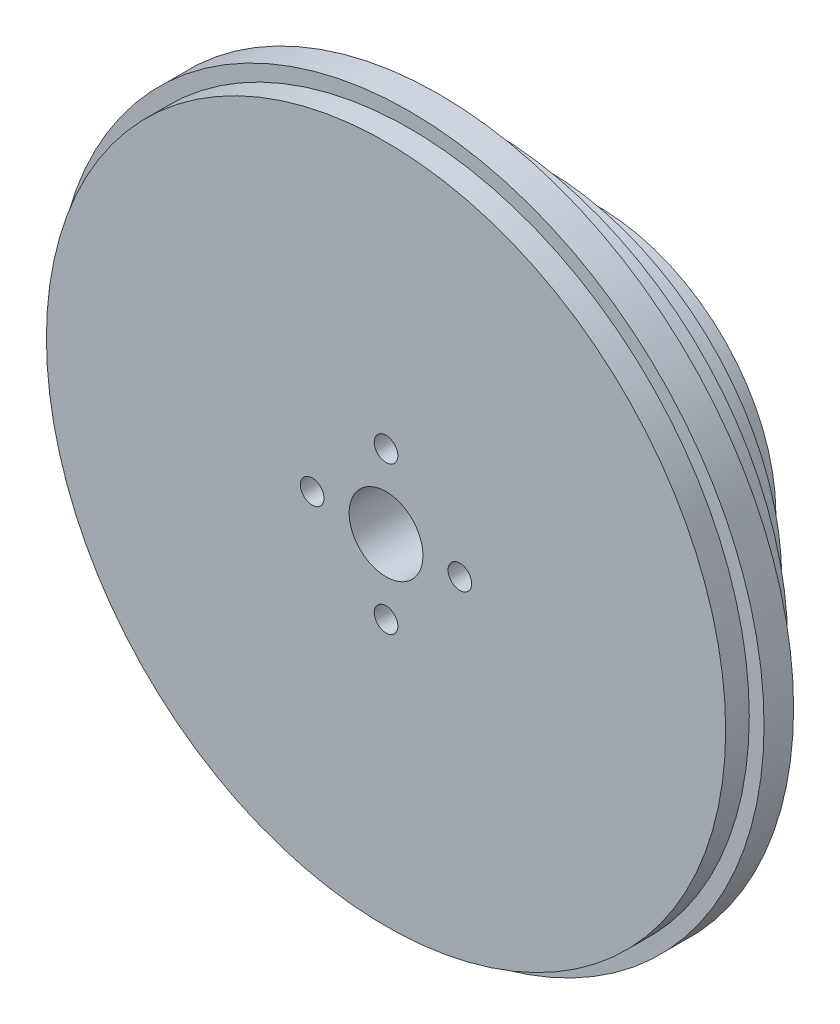
ISO-10303-21;
HEADER;
FILE_DESCRIPTION(('STEP AP214'),'2;1');
FILE_NAME('part.step','',(''),(''),'','','');
FILE_SCHEMA(('AUTOMOTIVE_DESIGN { 1 0 10303 214 1 1 1 1 }'));
ENDSEC;
DATA;
#1=APPLICATION_CONTEXT('core data for automotive mechanical design processes');
#2=APPLICATION_PROTOCOL_DEFINITION('international standard','automotive_design',2000,#1);
#3=PRODUCT_CONTEXT('',#1,'mechanical');
#4=PRODUCT('Part','Part','',(#3));
#5=PRODUCT_RELATED_PRODUCT_CATEGORY('part','',(#4));
#6=PRODUCT_DEFINITION_FORMATION('','',#4);
#7=PRODUCT_DEFINITION_CONTEXT('part definition',#1,'design');
#8=PRODUCT_DEFINITION('design','',#6,#7);
#9=PRODUCT_DEFINITION_SHAPE('','',#8);
#10=(LENGTH_UNIT() NAMED_UNIT(*) SI_UNIT(.MILLI.,.METRE.));
#11=(NAMED_UNIT(*) PLANE_ANGLE_UNIT() SI_UNIT($,.RADIAN.));
#12=(NAMED_UNIT(*) SI_UNIT($,.STERADIAN.) SOLID_ANGLE_UNIT());
#13=UNCERTAINTY_MEASURE_WITH_UNIT(LENGTH_MEASURE(1.E-05),#10,'distance_accuracy_value','');
#14=(GEOMETRIC_REPRESENTATION_CONTEXT(3) GLOBAL_UNCERTAINTY_ASSIGNED_CONTEXT((#13)) GLOBAL_UNIT_ASSIGNED_CONTEXT((#10,
#11,#12)) REPRESENTATION_CONTEXT('',''));
#15=CARTESIAN_POINT('',(0.,0.,0.));
#16=DIRECTION('',(0.,0.,1.));
#17=DIRECTION('',(1.,0.,0.));
#18=AXIS2_PLACEMENT_3D('',#15,#16,#17);
#19=CARTESIAN_POINT('',(0.,0.,51.));
#20=DIRECTION('',(0.,0.,1.));
#21=DIRECTION('',(1.,0.,0.));
#22=AXIS2_PLACEMENT_3D('',#19,#20,#21);
#23=PLANE('',#22);
#24=CARTESIAN_POINT('',(0.,0.,51.));
#25=DIRECTION('',(0.,0.,1.));
#26=DIRECTION('',(1.,0.,0.));
#27=AXIS2_PLACEMENT_3D('',#24,#25,#26);
#28=CIRCLE('',#27,100.);
#29=CARTESIAN_POINT('',(100.,0.,51.));
#30=VERTEX_POINT('',#29);
#31=EDGE_CURVE('E24',#30,#30,#28,.T.);
#32=ORIENTED_EDGE('',*,*,#31,.F.);
#33=EDGE_LOOP('',(#32));
#34=FACE_BOUND('',#33,.T.);
#35=CARTESIAN_POINT('',(0.,0.,51.));
#36=DIRECTION('',(0.,0.,1.));
#37=DIRECTION('',(1.,0.,0.));
#38=AXIS2_PLACEMENT_3D('',#35,#36,#37);
#39=CIRCLE('',#38,75.);
#40=CARTESIAN_POINT('',(75.,0.,51.));
#41=VERTEX_POINT('',#40);
#42=EDGE_CURVE('E41',#41,#41,#39,.T.);
#43=ORIENTED_EDGE('',*,*,#42,.T.);
#44=EDGE_LOOP('',(#43));
#45=FACE_BOUND('',#44,.T.);
#46=ADVANCED_FACE('F16',(#34,#45),#23,.F.);
#47=CARTESIAN_POINT('',(0.,0.,51.));
#48=DIRECTION('',(0.,0.,1.));
#49=DIRECTION('',(1.,0.,0.));
#50=AXIS2_PLACEMENT_3D('',#47,#48,#49);
#51=CYLINDRICAL_SURFACE('',#50,100.);
#52=ORIENTED_EDGE('',*,*,#31,.T.);
#53=DIRECTION('',(0.,0.,1.));
#54=VECTOR('',#53,1.);
#55=CARTESIAN_POINT('',(100.,0.,51.));
#56=LINE('',#55,#54);
#57=CARTESIAN_POINT('',(100.,0.,61.));
#58=VERTEX_POINT('',#57);
#59=EDGE_CURVE('E10',#30,#58,#56,.T.);
#60=ORIENTED_EDGE('',*,*,#59,.T.);
#61=CARTESIAN_POINT('',(0.,0.,61.));
#62=DIRECTION('',(0.,0.,1.));
#63=DIRECTION('',(1.,0.,0.));
#64=AXIS2_PLACEMENT_3D('',#61,#62,#63);
#65=CIRCLE('',#64,100.);
#66=EDGE_CURVE('E219',#58,#58,#65,.T.);
#67=ORIENTED_EDGE('',*,*,#66,.F.);
#68=ORIENTED_EDGE('',*,*,#59,.F.);
#69=EDGE_LOOP('',(#52,#60,#67,#68));
#70=FACE_BOUND('',#69,.T.);
#71=ADVANCED_FACE('F332',(#70),#51,.T.);
#72=CARTESIAN_POINT('',(0.,0.,43.));
#73=DIRECTION('',(0.,0.,1.));
#74=DIRECTION('',(1.,0.,0.));
#75=AXIS2_PLACEMENT_3D('',#72,#73,#74);
#76=CYLINDRICAL_SURFACE('',#75,75.);
#77=CARTESIAN_POINT('',(0.,0.,43.));
#78=DIRECTION('',(0.,0.,1.));
#79=DIRECTION('',(1.,0.,0.));
#80=AXIS2_PLACEMENT_3D('',#77,#78,#79);
#81=CIRCLE('',#80,75.);
#82=CARTESIAN_POINT('',(75.,0.,43.));
#83=VERTEX_POINT('',#82);
#84=EDGE_CURVE('E224',#83,#83,#81,.T.);
#85=ORIENTED_EDGE('',*,*,#84,.T.);
#86=DIRECTION('',(0.,0.,1.));
#87=VECTOR('',#86,1.);
#88=CARTESIAN_POINT('',(75.,0.,43.));
#89=LINE('',#88,#87);
#90=EDGE_CURVE('E223',#83,#41,#89,.T.);
#91=ORIENTED_EDGE('',*,*,#90,.T.);
#92=ORIENTED_EDGE('',*,*,#42,.F.);
#93=ORIENTED_EDGE('',*,*,#90,.F.);
#94=EDGE_LOOP('',(#85,#91,#92,#93));
#95=FACE_BOUND('',#94,.T.);
#96=ADVANCED_FACE('F337',(#95),#76,.T.);
#97=CARTESIAN_POINT('',(0.,0.,61.));
#98=DIRECTION('',(0.,0.,1.));
#99=DIRECTION('',(1.,0.,0.));
#100=AXIS2_PLACEMENT_3D('',#97,#98,#99);
#101=PLANE('',#100);
#102=CARTESIAN_POINT('',(0.,0.,61.));
#103=DIRECTION('',(0.,0.,1.));
#104=DIRECTION('',(1.,0.,0.));
#105=AXIS2_PLACEMENT_3D('',#102,#103,#104);
#106=CIRCLE('',#105,95.);
#107=CARTESIAN_POINT('',(95.,0.,61.));
#108=VERTEX_POINT('',#107);
#109=EDGE_CURVE('E257',#108,#108,#106,.T.);
#110=ORIENTED_EDGE('',*,*,#109,.F.);
#111=EDGE_LOOP('',(#110));
#112=FACE_BOUND('',#111,.T.);
#113=ORIENTED_EDGE('',*,*,#66,.T.);
#114=EDGE_LOOP('',(#113));
#115=FACE_BOUND('',#114,.T.);
#116=ADVANCED_FACE('F341',(#112,#115),#101,.T.);
#117=CARTESIAN_POINT('',(0.,0.,43.));
#118=DIRECTION('',(0.,0.,1.));
#119=DIRECTION('',(1.,0.,0.));
#120=AXIS2_PLACEMENT_3D('',#117,#118,#119);
#121=PLANE('',#120);
#122=ORIENTED_EDGE('',*,*,#84,.F.);
#123=EDGE_LOOP('',(#122));
#124=FACE_BOUND('',#123,.T.);
#125=CARTESIAN_POINT('',(0.,0.,43.));
#126=DIRECTION('',(0.,0.,1.));
#127=DIRECTION('',(1.,0.,0.));
#128=AXIS2_PLACEMENT_3D('',#125,#126,#127);
#129=CIRCLE('',#128,80.);
#130=CARTESIAN_POINT('',(80.,0.,43.));
#131=VERTEX_POINT('',#130);
#132=EDGE_CURVE('E254',#131,#131,#129,.T.);
#133=ORIENTED_EDGE('',*,*,#132,.T.);
#134=EDGE_LOOP('',(#133));
#135=FACE_BOUND('',#134,.T.);
#136=ADVANCED_FACE('F347',(#124,#135),#121,.T.);
#137=CARTESIAN_POINT('',(0.,0.,61.));
#138=DIRECTION('',(0.,0.,1.));
#139=DIRECTION('',(1.,0.,0.));
#140=AXIS2_PLACEMENT_3D('',#137,#138,#139);
#141=CYLINDRICAL_SURFACE('',#140,95.);
#142=ORIENTED_EDGE('',*,*,#109,.T.);
#143=DIRECTION('',(0.,0.,1.));
#144=VECTOR('',#143,1.);
#145=CARTESIAN_POINT('',(95.,0.,61.));
#146=LINE('',#145,#144);
#147=CARTESIAN_POINT('',(95.,0.,69.));
#148=VERTEX_POINT('',#147);
#149=EDGE_CURVE('E261',#108,#148,#146,.T.);
#150=ORIENTED_EDGE('',*,*,#149,.T.);
#151=CARTESIAN_POINT('',(0.,0.,69.));
#152=DIRECTION('',(0.,0.,1.));
#153=DIRECTION('',(1.,0.,0.));
#154=AXIS2_PLACEMENT_3D('',#151,#152,#153);
#155=CIRCLE('',#154,95.);
#156=EDGE_CURVE('E246',#148,#148,#155,.T.);
#157=ORIENTED_EDGE('',*,*,#156,.F.);
#158=ORIENTED_EDGE('',*,*,#149,.F.);
#159=EDGE_LOOP('',(#142,#150,#157,#158));
#160=FACE_BOUND('',#159,.T.);
#161=ADVANCED_FACE('F351',(#160),#141,.T.);
#162=CARTESIAN_POINT('',(0.,0.,33.));
#163=DIRECTION('',(0.,0.,1.));
#164=DIRECTION('',(1.,0.,0.));
#165=AXIS2_PLACEMENT_3D('',#162,#163,#164);
#166=CYLINDRICAL_SURFACE('',#165,80.);
#167=CARTESIAN_POINT('',(0.,0.,33.));
#168=DIRECTION('',(0.,0.,1.));
#169=DIRECTION('',(1.,0.,0.));
#170=AXIS2_PLACEMENT_3D('',#167,#168,#169);
#171=CIRCLE('',#170,80.);
#172=CARTESIAN_POINT('',(80.,0.,33.));
#173=VERTEX_POINT('',#172);
#174=EDGE_CURVE('E242',#173,#173,#171,.T.);
#175=ORIENTED_EDGE('',*,*,#174,.T.);
#176=DIRECTION('',(0.,0.,1.));
#177=VECTOR('',#176,1.);
#178=CARTESIAN_POINT('',(80.,0.,33.));
#179=LINE('',#178,#177);
#180=EDGE_CURVE('E250',#173,#131,#179,.T.);
#181=ORIENTED_EDGE('',*,*,#180,.T.);
#182=ORIENTED_EDGE('',*,*,#132,.F.);
#183=ORIENTED_EDGE('',*,*,#180,.F.);
#184=EDGE_LOOP('',(#175,#181,#182,#183));
#185=FACE_BOUND('',#184,.T.);
#186=ADVANCED_FACE('F355',(#185),#166,.T.);
#187=CARTESIAN_POINT('',(0.,0.,69.));
#188=DIRECTION('',(0.,0.,1.));
#189=DIRECTION('',(1.,0.,0.));
#190=AXIS2_PLACEMENT_3D('',#187,#188,#189);
#191=PLANE('',#190);
#192=CARTESIAN_POINT('',(0.,0.,69.));
#193=DIRECTION('',(0.,0.,1.));
#194=DIRECTION('',(1.,0.,0.));
#195=AXIS2_PLACEMENT_3D('',#192,#193,#194);
#196=CIRCLE('',#195,120.);
#197=CARTESIAN_POINT('',(120.,0.,69.));
#198=VERTEX_POINT('',#197);
#199=EDGE_CURVE('E235',#198,#198,#196,.T.);
#200=ORIENTED_EDGE('',*,*,#199,.F.);
#201=EDGE_LOOP('',(#200));
#202=FACE_BOUND('',#201,.T.);
#203=ORIENTED_EDGE('',*,*,#156,.T.);
#204=EDGE_LOOP('',(#203));
#205=FACE_BOUND('',#204,.T.);
#206=ADVANCED_FACE('F357',(#202,#205),#191,.F.);
#207=CARTESIAN_POINT('',(0.,0.,33.));
#208=DIRECTION('',(0.,0.,1.));
#209=DIRECTION('',(1.,0.,0.));
#210=AXIS2_PLACEMENT_3D('',#207,#208,#209);
#211=PLANE('',#210);
#212=ORIENTED_EDGE('',*,*,#174,.F.);
#213=EDGE_LOOP('',(#212));
#214=FACE_BOUND('',#213,.T.);
#215=CARTESIAN_POINT('',(0.,0.,33.));
#216=DIRECTION('',(0.,0.,1.));
#217=DIRECTION('',(1.,0.,0.));
#218=AXIS2_PLACEMENT_3D('',#215,#216,#217);
#219=CIRCLE('',#218,55.);
#220=CARTESIAN_POINT('',(55.,0.,33.));
#221=VERTEX_POINT('',#220);
#222=EDGE_CURVE('E232',#221,#221,#219,.T.);
#223=ORIENTED_EDGE('',*,*,#222,.T.);
#224=EDGE_LOOP('',(#223));
#225=FACE_BOUND('',#224,.T.);
#226=ADVANCED_FACE('F360',(#214,#225),#211,.F.);
#227=CARTESIAN_POINT('',(0.,0.,69.));
#228=DIRECTION('',(0.,0.,1.));
#229=DIRECTION('',(1.,0.,0.));
#230=AXIS2_PLACEMENT_3D('',#227,#228,#229);
#231=CYLINDRICAL_SURFACE('',#230,120.);
#232=ORIENTED_EDGE('',*,*,#199,.T.);
#233=DIRECTION('',(0.,0.,1.));
#234=VECTOR('',#233,1.);
#235=CARTESIAN_POINT('',(120.,0.,69.));
#236=LINE('',#235,#234);
#237=CARTESIAN_POINT('',(120.,0.,79.));
#238=VERTEX_POINT('',#237);
#239=EDGE_CURVE('E239',#198,#238,#236,.T.);
#240=ORIENTED_EDGE('',*,*,#239,.T.);
#241=CARTESIAN_POINT('',(0.,0.,79.));
#242=DIRECTION('',(0.,0.,1.));
#243=DIRECTION('',(1.,0.,0.));
#244=AXIS2_PLACEMENT_3D('',#241,#242,#243);
#245=CIRCLE('',#244,120.);
#246=EDGE_CURVE('E218',#238,#238,#245,.T.);
#247=ORIENTED_EDGE('',*,*,#246,.F.);
#248=ORIENTED_EDGE('',*,*,#239,.F.);
#249=EDGE_LOOP('',(#232,#240,#247,#248));
#250=FACE_BOUND('',#249,.T.);
#251=ADVANCED_FACE('F364',(#250),#231,.T.);
#252=CARTESIAN_POINT('',(0.,0.,25.));
#253=DIRECTION('',(0.,0.,1.));
#254=DIRECTION('',(1.,0.,0.));
#255=AXIS2_PLACEMENT_3D('',#252,#253,#254);
#256=CYLINDRICAL_SURFACE('',#255,55.);
#257=CARTESIAN_POINT('',(0.,0.,25.));
#258=DIRECTION('',(0.,0.,1.));
#259=DIRECTION('',(1.,0.,0.));
#260=AXIS2_PLACEMENT_3D('',#257,#258,#259);
#261=CIRCLE('',#260,55.);
#262=CARTESIAN_POINT('',(55.,0.,25.));
#263=VERTEX_POINT('',#262);
#264=EDGE_CURVE('E214',#263,#263,#261,.T.);
#265=ORIENTED_EDGE('',*,*,#264,.T.);
#266=DIRECTION('',(0.,0.,1.));
#267=VECTOR('',#266,1.);
#268=CARTESIAN_POINT('',(55.,0.,25.));
#269=LINE('',#268,#267);
#270=EDGE_CURVE('E228',#263,#221,#269,.T.);
#271=ORIENTED_EDGE('',*,*,#270,.T.);
#272=ORIENTED_EDGE('',*,*,#222,.F.);
#273=ORIENTED_EDGE('',*,*,#270,.F.);
#274=EDGE_LOOP('',(#265,#271,#272,#273));
#275=FACE_BOUND('',#274,.T.);
#276=ADVANCED_FACE('F368',(#275),#256,.T.);
#277=CARTESIAN_POINT('',(0.,0.,79.));
#278=DIRECTION('',(0.,0.,1.));
#279=DIRECTION('',(1.,0.,0.));
#280=AXIS2_PLACEMENT_3D('',#277,#278,#279);
#281=PLANE('',#280);
#282=CARTESIAN_POINT('',(0.,0.,79.));
#283=DIRECTION('',(0.,0.,1.));
#284=DIRECTION('',(1.,0.,0.));
#285=AXIS2_PLACEMENT_3D('',#282,#283,#284);
#286=CIRCLE('',#285,115.);
#287=CARTESIAN_POINT('',(115.,0.,79.));
#288=VERTEX_POINT('',#287);
#289=EDGE_CURVE('E207',#288,#288,#286,.T.);
#290=ORIENTED_EDGE('',*,*,#289,.F.);
#291=EDGE_LOOP('',(#290));
#292=FACE_BOUND('',#291,.T.);
#293=ORIENTED_EDGE('',*,*,#246,.T.);
#294=EDGE_LOOP('',(#293));
#295=FACE_BOUND('',#294,.T.);
#296=ADVANCED_FACE('F373',(#292,#295),#281,.T.);
#297=CARTESIAN_POINT('',(0.,0.,25.));
#298=DIRECTION('',(0.,0.,1.));
#299=DIRECTION('',(1.,0.,0.));
#300=AXIS2_PLACEMENT_3D('',#297,#298,#299);
#301=PLANE('',#300);
#302=ORIENTED_EDGE('',*,*,#264,.F.);
#303=EDGE_LOOP('',(#302));
#304=FACE_BOUND('',#303,.T.);
#305=CARTESIAN_POINT('',(0.,0.,25.));
#306=DIRECTION('',(0.,0.,1.));
#307=DIRECTION('',(1.,0.,0.));
#308=AXIS2_PLACEMENT_3D('',#305,#306,#307);
#309=CIRCLE('',#308,60.);
#310=CARTESIAN_POINT('',(60.,0.,25.));
#311=VERTEX_POINT('',#310);
#312=EDGE_CURVE('E204',#311,#311,#309,.T.);
#313=ORIENTED_EDGE('',*,*,#312,.T.);
#314=EDGE_LOOP('',(#313));
#315=FACE_BOUND('',#314,.T.);
#316=ADVANCED_FACE('F376',(#304,#315),#301,.T.);
#317=CARTESIAN_POINT('',(0.,0.,79.));
#318=DIRECTION('',(0.,0.,1.));
#319=DIRECTION('',(1.,0.,0.));
#320=AXIS2_PLACEMENT_3D('',#317,#318,#319);
#321=CYLINDRICAL_SURFACE('',#320,115.);
#322=ORIENTED_EDGE('',*,*,#289,.T.);
#323=DIRECTION('',(0.,0.,1.));
#324=VECTOR('',#323,1.);
#325=CARTESIAN_POINT('',(115.,0.,79.));
#326=LINE('',#325,#324);
#327=CARTESIAN_POINT('',(115.,0.,87.));
#328=VERTEX_POINT('',#327);
#329=EDGE_CURVE('E211',#288,#328,#326,.T.);
#330=ORIENTED_EDGE('',*,*,#329,.T.);
#331=CARTESIAN_POINT('',(0.,0.,87.));
#332=DIRECTION('',(0.,0.,1.));
#333=DIRECTION('',(1.,0.,0.));
#334=AXIS2_PLACEMENT_3D('',#331,#332,#333);
#335=CIRCLE('',#334,115.);
#336=EDGE_CURVE('E196',#328,#328,#335,.T.);
#337=ORIENTED_EDGE('',*,*,#336,.F.);
#338=ORIENTED_EDGE('',*,*,#329,.F.);
#339=EDGE_LOOP('',(#322,#330,#337,#338));
#340=FACE_BOUND('',#339,.T.);
#341=ADVANCED_FACE('F378',(#340),#321,.T.);
#342=CARTESIAN_POINT('',(0.,0.,15.));
#343=DIRECTION('',(0.,0.,1.));
#344=DIRECTION('',(1.,0.,0.));
#345=AXIS2_PLACEMENT_3D('',#342,#343,#344);
#346=CYLINDRICAL_SURFACE('',#345,60.);
#347=CARTESIAN_POINT('',(0.,0.,15.));
#348=DIRECTION('',(0.,0.,1.));
#349=DIRECTION('',(1.,0.,0.));
#350=AXIS2_PLACEMENT_3D('',#347,#348,#349);
#351=CIRCLE('',#350,60.);
#352=CARTESIAN_POINT('',(60.,0.,15.));
#353=VERTEX_POINT('',#352);
#354=EDGE_CURVE('E192',#353,#353,#351,.T.);
#355=ORIENTED_EDGE('',*,*,#354,.T.);
#356=DIRECTION('',(0.,0.,1.));
#357=VECTOR('',#356,1.);
#358=CARTESIAN_POINT('',(60.,0.,15.));
#359=LINE('',#358,#357);
#360=EDGE_CURVE('E200',#353,#311,#359,.T.);
#361=ORIENTED_EDGE('',*,*,#360,.T.);
#362=ORIENTED_EDGE('',*,*,#312,.F.);
#363=ORIENTED_EDGE('',*,*,#360,.F.);
#364=EDGE_LOOP('',(#355,#361,#362,#363));
#365=FACE_BOUND('',#364,.T.);
#366=ADVANCED_FACE('F381',(#365),#346,.T.);
#367=CARTESIAN_POINT('',(0.,0.,87.));
#368=DIRECTION('',(0.,0.,1.));
#369=DIRECTION('',(1.,0.,0.));
#370=AXIS2_PLACEMENT_3D('',#367,#368,#369);
#371=PLANE('',#370);
#372=CARTESIAN_POINT('',(0.,25.,87.));
#373=DIRECTION('',(0.,0.,-1.));
#374=DIRECTION('',(0.,1.,0.));
#375=AXIS2_PLACEMENT_3D('',#372,#373,#374);
#376=CIRCLE('',#375,4.);
#377=CARTESIAN_POINT('',(0.,29.,87.));
#378=VERTEX_POINT('',#377);
#379=EDGE_CURVE('E189',#378,#378,#376,.T.);
#380=ORIENTED_EDGE('',*,*,#379,.T.);
#381=EDGE_LOOP('',(#380));
#382=FACE_BOUND('',#381,.T.);
#383=CARTESIAN_POINT('',(25.,0.,87.));
#384=DIRECTION('',(0.,0.,-1.));
#385=DIRECTION('',(1.,0.,0.));
#386=AXIS2_PLACEMENT_3D('',#383,#384,#385);
#387=CIRCLE('',#386,4.);
#388=CARTESIAN_POINT('',(29.,0.,87.));
#389=VERTEX_POINT('',#388);
#390=EDGE_CURVE('E173',#389,#389,#387,.T.);
#391=ORIENTED_EDGE('',*,*,#390,.T.);
#392=EDGE_LOOP('',(#391));
#393=FACE_BOUND('',#392,.T.);
#394=CARTESIAN_POINT('',(0.,0.,87.));
#395=DIRECTION('',(0.,0.,-1.));
#396=DIRECTION('',(1.,0.,0.));
#397=AXIS2_PLACEMENT_3D('',#394,#395,#396);
#398=CIRCLE('',#397,12.5);
#399=CARTESIAN_POINT('',(12.5,0.,87.));
#400=VERTEX_POINT('',#399);
#401=EDGE_CURVE('E180',#400,#400,#398,.T.);
#402=ORIENTED_EDGE('',*,*,#401,.T.);
#403=EDGE_LOOP('',(#402));
#404=FACE_BOUND('',#403,.T.);
#405=CARTESIAN_POINT('',(-25.,0.,87.));
#406=DIRECTION('',(0.,0.,-1.));
#407=DIRECTION('',(-1.,0.,0.));
#408=AXIS2_PLACEMENT_3D('',#405,#406,#407);
#409=CIRCLE('',#408,4.);
#410=CARTESIAN_POINT('',(-29.,0.,87.));
#411=VERTEX_POINT('',#410);
#412=EDGE_CURVE('E181',#411,#411,#409,.T.);
#413=ORIENTED_EDGE('',*,*,#412,.T.);
#414=EDGE_LOOP('',(#413));
#415=FACE_BOUND('',#414,.T.);
#416=CARTESIAN_POINT('',(0.,-25.,87.));
#417=DIRECTION('',(0.,0.,-1.));
#418=DIRECTION('',(0.,-1.,0.));
#419=AXIS2_PLACEMENT_3D('',#416,#417,#418);
#420=CIRCLE('',#419,4.);
#421=CARTESIAN_POINT('',(0.,-29.,87.));
#422=VERTEX_POINT('',#421);
#423=EDGE_CURVE('E170',#422,#422,#420,.T.);
#424=ORIENTED_EDGE('',*,*,#423,.T.);
#425=EDGE_LOOP('',(#424));
#426=FACE_BOUND('',#425,.T.);
#427=ORIENTED_EDGE('',*,*,#336,.T.);
#428=EDGE_LOOP('',(#427));
#429=FACE_BOUND('',#428,.T.);
#430=ADVANCED_FACE('F386',(#382,#393,#404,#415,#426,#429),#371,.T.);
#431=CARTESIAN_POINT('',(0.,0.,15.));
#432=DIRECTION('',(0.,0.,1.));
#433=DIRECTION('',(1.,0.,0.));
#434=AXIS2_PLACEMENT_3D('',#431,#432,#433);
#435=PLANE('',#434);
#436=ORIENTED_EDGE('',*,*,#354,.F.);
#437=EDGE_LOOP('',(#436));
#438=FACE_BOUND('',#437,.T.);
#439=CARTESIAN_POINT('',(0.,0.,15.));
#440=DIRECTION('',(0.,0.,1.));
#441=DIRECTION('',(1.,0.,0.));
#442=AXIS2_PLACEMENT_3D('',#439,#440,#441);
#443=CIRCLE('',#442,30.);
#444=CARTESIAN_POINT('',(30.,0.,15.));
#445=VERTEX_POINT('',#444);
#446=EDGE_CURVE('E153',#445,#445,#443,.T.);
#447=ORIENTED_EDGE('',*,*,#446,.T.);
#448=EDGE_LOOP('',(#447));
#449=FACE_BOUND('',#448,.T.);
#450=ADVANCED_FACE('F389',(#438,#449),#435,.F.);
#451=CARTESIAN_POINT('',(0.,25.,0.));
#452=DIRECTION('',(0.,0.,-1.));
#453=DIRECTION('',(0.,1.,0.));
#454=AXIS2_PLACEMENT_3D('',#451,#452,#453);
#455=CYLINDRICAL_SURFACE('',#454,4.);
#456=CARTESIAN_POINT('',(0.,25.,0.));
#457=DIRECTION('',(0.,0.,1.));
#458=DIRECTION('',(0.,1.,0.));
#459=AXIS2_PLACEMENT_3D('',#456,#457,#458);
#460=CIRCLE('',#459,4.);
#461=CARTESIAN_POINT('',(0.,29.,0.));
#462=VERTEX_POINT('',#461);
#463=EDGE_CURVE('E155',#462,#462,#460,.T.);
#464=ORIENTED_EDGE('',*,*,#463,.F.);
#465=DIRECTION('',(0.,0.,1.));
#466=VECTOR('',#465,1.);
#467=CARTESIAN_POINT('',(0.,29.,0.));
#468=LINE('',#467,#466);
#469=EDGE_CURVE('E184',#462,#378,#468,.T.);
#470=ORIENTED_EDGE('',*,*,#469,.T.);
#471=ORIENTED_EDGE('',*,*,#379,.F.);
#472=ORIENTED_EDGE('',*,*,#469,.F.);
#473=EDGE_LOOP('',(#464,#470,#471,#472));
#474=FACE_BOUND('',#473,.T.);
#475=ADVANCED_FACE('F327',(#474),#455,.F.);
#476=CARTESIAN_POINT('',(-25.,0.,0.));
#477=DIRECTION('',(0.,0.,-1.));
#478=DIRECTION('',(-1.,0.,0.));
#479=AXIS2_PLACEMENT_3D('',#476,#477,#478);
#480=CYLINDRICAL_SURFACE('',#479,4.);
#481=CARTESIAN_POINT('',(-25.,0.,0.));
#482=DIRECTION('',(0.,0.,1.));
#483=DIRECTION('',(-1.,0.,0.));
#484=AXIS2_PLACEMENT_3D('',#481,#482,#483);
#485=CIRCLE('',#484,4.);
#486=CARTESIAN_POINT('',(-29.,0.,0.));
#487=VERTEX_POINT('',#486);
#488=EDGE_CURVE('E165',#487,#487,#485,.T.);
#489=ORIENTED_EDGE('',*,*,#488,.F.);
#490=DIRECTION('',(0.,0.,1.));
#491=VECTOR('',#490,1.);
#492=CARTESIAN_POINT('',(-29.,0.,0.));
#493=LINE('',#492,#491);
#494=EDGE_CURVE('E185',#487,#411,#493,.T.);
#495=ORIENTED_EDGE('',*,*,#494,.T.);
#496=ORIENTED_EDGE('',*,*,#412,.F.);
#497=ORIENTED_EDGE('',*,*,#494,.F.);
#498=EDGE_LOOP('',(#489,#495,#496,#497));
#499=FACE_BOUND('',#498,.T.);
#500=ADVANCED_FACE('F317',(#499),#480,.F.);
#501=CARTESIAN_POINT('',(0.,0.,0.));
#502=DIRECTION('',(0.,0.,-1.));
#503=DIRECTION('',(1.,0.,0.));
#504=AXIS2_PLACEMENT_3D('',#501,#502,#503);
#505=CYLINDRICAL_SURFACE('',#504,12.5);
#506=CARTESIAN_POINT('',(0.,0.,0.));
#507=DIRECTION('',(0.,0.,1.));
#508=DIRECTION('',(1.,0.,0.));
#509=AXIS2_PLACEMENT_3D('',#506,#507,#508);
#510=CIRCLE('',#509,12.5);
#511=CARTESIAN_POINT('',(12.5,0.,0.));
#512=VERTEX_POINT('',#511);
#513=EDGE_CURVE('E278',#512,#512,#510,.T.);
#514=ORIENTED_EDGE('',*,*,#513,.F.);
#515=DIRECTION('',(0.,0.,1.));
#516=VECTOR('',#515,1.);
#517=CARTESIAN_POINT('',(12.5,0.,0.));
#518=LINE('',#517,#516);
#519=EDGE_CURVE('E176',#512,#400,#518,.T.);
#520=ORIENTED_EDGE('',*,*,#519,.T.);
#521=ORIENTED_EDGE('',*,*,#401,.F.);
#522=ORIENTED_EDGE('',*,*,#519,.F.);
#523=EDGE_LOOP('',(#514,#520,#521,#522));
#524=FACE_BOUND('',#523,.T.);
#525=ADVANCED_FACE('F314',(#524),#505,.F.);
#526=CARTESIAN_POINT('',(25.,0.,0.));
#527=DIRECTION('',(0.,0.,-1.));
#528=DIRECTION('',(1.,0.,0.));
#529=AXIS2_PLACEMENT_3D('',#526,#527,#528);
#530=CYLINDRICAL_SURFACE('',#529,4.);
#531=CARTESIAN_POINT('',(25.,0.,0.));
#532=DIRECTION('',(0.,0.,1.));
#533=DIRECTION('',(1.,0.,0.));
#534=AXIS2_PLACEMENT_3D('',#531,#532,#533);
#535=CIRCLE('',#534,4.);
#536=CARTESIAN_POINT('',(29.,0.,0.));
#537=VERTEX_POINT('',#536);
#538=EDGE_CURVE('E296',#537,#537,#535,.T.);
#539=ORIENTED_EDGE('',*,*,#538,.F.);
#540=DIRECTION('',(0.,0.,1.));
#541=VECTOR('',#540,1.);
#542=CARTESIAN_POINT('',(29.,0.,0.));
#543=LINE('',#542,#541);
#544=EDGE_CURVE('E172',#537,#389,#543,.T.);
#545=ORIENTED_EDGE('',*,*,#544,.T.);
#546=ORIENTED_EDGE('',*,*,#390,.F.);
#547=ORIENTED_EDGE('',*,*,#544,.F.);
#548=EDGE_LOOP('',(#539,#545,#546,#547));
#549=FACE_BOUND('',#548,.T.);
#550=ADVANCED_FACE('F316',(#549),#530,.F.);
#551=CARTESIAN_POINT('',(0.,-25.,0.));
#552=DIRECTION('',(0.,0.,-1.));
#553=DIRECTION('',(0.,-1.,0.));
#554=AXIS2_PLACEMENT_3D('',#551,#552,#553);
#555=CYLINDRICAL_SURFACE('',#554,4.);
#556=CARTESIAN_POINT('',(0.,-25.,0.));
#557=DIRECTION('',(0.,0.,1.));
#558=DIRECTION('',(0.,-1.,0.));
#559=AXIS2_PLACEMENT_3D('',#556,#557,#558);
#560=CIRCLE('',#559,4.);
#561=CARTESIAN_POINT('',(0.,-29.,0.));
#562=VERTEX_POINT('',#561);
#563=EDGE_CURVE('E293',#562,#562,#560,.T.);
#564=ORIENTED_EDGE('',*,*,#563,.F.);
#565=DIRECTION('',(0.,0.,1.));
#566=VECTOR('',#565,1.);
#567=CARTESIAN_POINT('',(0.,-29.,0.));
#568=LINE('',#567,#566);
#569=EDGE_CURVE('E161',#562,#422,#568,.T.);
#570=ORIENTED_EDGE('',*,*,#569,.T.);
#571=ORIENTED_EDGE('',*,*,#423,.F.);
#572=ORIENTED_EDGE('',*,*,#569,.F.);
#573=EDGE_LOOP('',(#564,#570,#571,#572));
#574=FACE_BOUND('',#573,.T.);
#575=ADVANCED_FACE('F324',(#574),#555,.F.);
#576=CARTESIAN_POINT('',(0.,0.,0.));
#577=DIRECTION('',(0.,0.,1.));
#578=DIRECTION('',(1.,0.,0.));
#579=AXIS2_PLACEMENT_3D('',#576,#577,#578);
#580=CYLINDRICAL_SURFACE('',#579,30.);
#581=CARTESIAN_POINT('',(0.,0.,0.));
#582=DIRECTION('',(0.,0.,1.));
#583=DIRECTION('',(1.,0.,0.));
#584=AXIS2_PLACEMENT_3D('',#581,#582,#583);
#585=CIRCLE('',#584,30.);
#586=CARTESIAN_POINT('',(30.,0.,0.));
#587=VERTEX_POINT('',#586);
#588=EDGE_CURVE('E152',#587,#587,#585,.T.);
#589=ORIENTED_EDGE('',*,*,#588,.T.);
#590=DIRECTION('',(0.,0.,1.));
#591=VECTOR('',#590,1.);
#592=CARTESIAN_POINT('',(30.,0.,0.));
#593=LINE('',#592,#591);
#594=EDGE_CURVE('E149',#587,#445,#593,.T.);
#595=ORIENTED_EDGE('',*,*,#594,.T.);
#596=ORIENTED_EDGE('',*,*,#446,.F.);
#597=ORIENTED_EDGE('',*,*,#594,.F.);
#598=EDGE_LOOP('',(#589,#595,#596,#597));
#599=FACE_BOUND('',#598,.T.);
#600=ADVANCED_FACE('F150',(#599),#580,.T.);
#601=CARTESIAN_POINT('',(0.,0.,0.));
#602=DIRECTION('',(0.,0.,1.));
#603=DIRECTION('',(1.,0.,0.));
#604=AXIS2_PLACEMENT_3D('',#601,#602,#603);
#605=PLANE('',#604);
#606=ORIENTED_EDGE('',*,*,#463,.T.);
#607=EDGE_LOOP('',(#606));
#608=FACE_BOUND('',#607,.T.);
#609=ORIENTED_EDGE('',*,*,#488,.T.);
#610=EDGE_LOOP('',(#609));
#611=FACE_BOUND('',#610,.T.);
#612=ORIENTED_EDGE('',*,*,#513,.T.);
#613=EDGE_LOOP('',(#612));
#614=FACE_BOUND('',#613,.T.);
#615=ORIENTED_EDGE('',*,*,#538,.T.);
#616=EDGE_LOOP('',(#615));
#617=FACE_BOUND('',#616,.T.);
#618=ORIENTED_EDGE('',*,*,#563,.T.);
#619=EDGE_LOOP('',(#618));
#620=FACE_BOUND('',#619,.T.);
#621=ORIENTED_EDGE('',*,*,#588,.F.);
#622=EDGE_LOOP('',(#621));
#623=FACE_BOUND('',#622,.T.);
#624=ADVANCED_FACE('F312',(#608,#611,#614,#617,#620,#623),#605,.F.);
#625=CLOSED_SHELL('',(#46,#71,#96,#116,#136,#161,#186,#206,#226,#251,#276,#296,#316,#341,#366,
#430,#450,#475,#500,#525,#550,#575,#600,#624));
#626=MANIFOLD_SOLID_BREP('B1',#625);
#627=ADVANCED_BREP_SHAPE_REPRESENTATION('',(#18,#626),#14);
#628=SHAPE_DEFINITION_REPRESENTATION(#9,#627);
ENDSEC;
END-ISO-10303-21;
